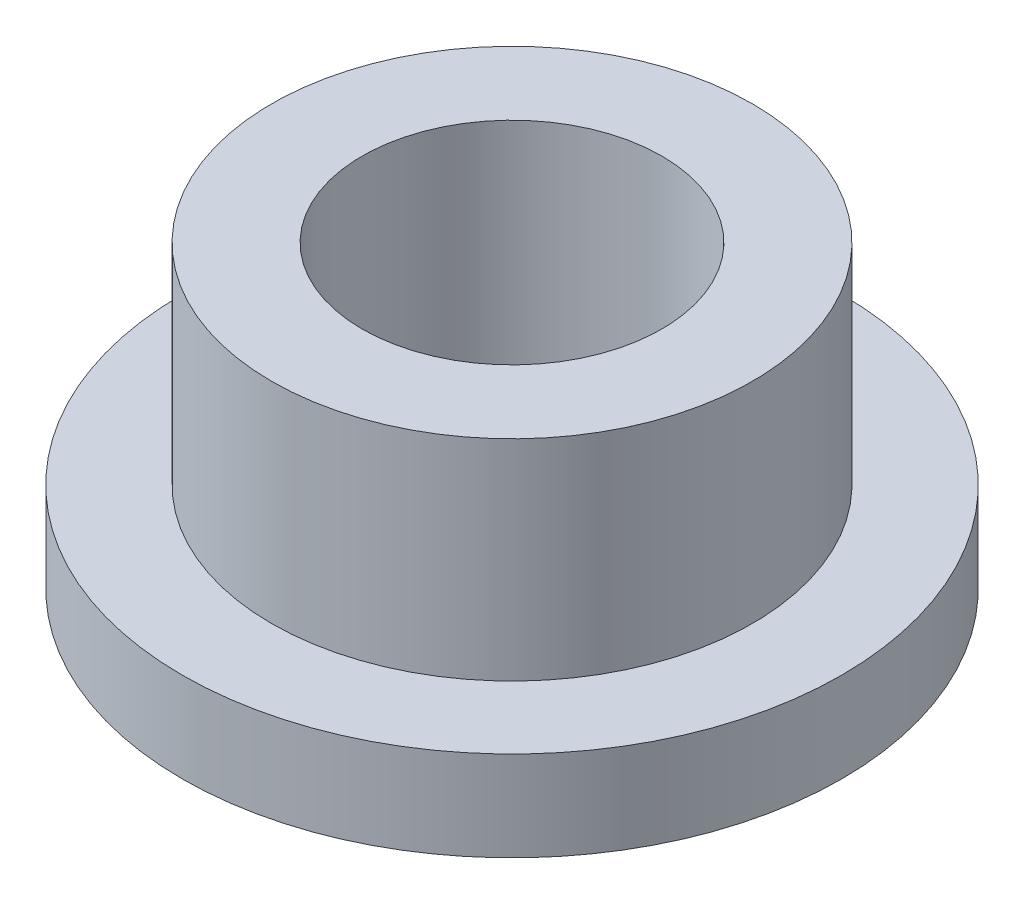
ISO-10303-21;
HEADER;
FILE_DESCRIPTION(('STEP AP214'),'2;1');
FILE_NAME('part.step','',(''),(''),'','','');
FILE_SCHEMA(('AUTOMOTIVE_DESIGN { 1 0 10303 214 1 1 1 1 }'));
ENDSEC;
DATA;
#1=APPLICATION_CONTEXT('core data for automotive mechanical design processes');
#2=APPLICATION_PROTOCOL_DEFINITION('international standard','automotive_design',2000,#1);
#3=PRODUCT_CONTEXT('',#1,'mechanical');
#4=PRODUCT('Part','Part','',(#3));
#5=PRODUCT_RELATED_PRODUCT_CATEGORY('part','',(#4));
#6=PRODUCT_DEFINITION_FORMATION('','',#4);
#7=PRODUCT_DEFINITION_CONTEXT('part definition',#1,'design');
#8=PRODUCT_DEFINITION('design','',#6,#7);
#9=PRODUCT_DEFINITION_SHAPE('','',#8);
#10=(LENGTH_UNIT() NAMED_UNIT(*) SI_UNIT(.MILLI.,.METRE.));
#11=(NAMED_UNIT(*) PLANE_ANGLE_UNIT() SI_UNIT($,.RADIAN.));
#12=(NAMED_UNIT(*) SI_UNIT($,.STERADIAN.) SOLID_ANGLE_UNIT());
#13=UNCERTAINTY_MEASURE_WITH_UNIT(LENGTH_MEASURE(1.E-05),#10,'distance_accuracy_value','');
#14=(GEOMETRIC_REPRESENTATION_CONTEXT(3) GLOBAL_UNCERTAINTY_ASSIGNED_CONTEXT((#13)) GLOBAL_UNIT_ASSIGNED_CONTEXT((#10,
#11,#12)) REPRESENTATION_CONTEXT('',''));
#15=CARTESIAN_POINT('',(0.,0.,0.));
#16=DIRECTION('',(0.,0.,1.));
#17=DIRECTION('',(1.,0.,0.));
#18=AXIS2_PLACEMENT_3D('',#15,#16,#17);
#19=CARTESIAN_POINT('',(0.,5.,0.));
#20=DIRECTION('',(0.,1.,0.));
#21=DIRECTION('',(0.,0.,1.));
#22=AXIS2_PLACEMENT_3D('',#19,#20,#21);
#23=PLANE('',#22);
#24=CARTESIAN_POINT('',(0.,5.,0.));
#25=DIRECTION('',(0.,1.,0.));
#26=DIRECTION('',(0.,0.,1.));
#27=AXIS2_PLACEMENT_3D('',#24,#25,#26);
#28=CIRCLE('',#27,4.01);
#29=CARTESIAN_POINT('',(0.,5.,4.01));
#30=VERTEX_POINT('',#29);
#31=EDGE_CURVE('E10',#30,#30,#28,.T.);
#32=ORIENTED_EDGE('',*,*,#31,.T.);
#33=EDGE_LOOP('',(#32));
#34=FACE_BOUND('',#33,.T.);
#35=CARTESIAN_POINT('',(0.,5.,0.));
#36=DIRECTION('',(0.,1.,0.));
#37=DIRECTION('',(0.,0.,1.));
#38=AXIS2_PLACEMENT_3D('',#35,#36,#37);
#39=CIRCLE('',#38,2.5);
#40=CARTESIAN_POINT('',(0.,5.,2.5));
#41=VERTEX_POINT('',#40);
#42=EDGE_CURVE('E37',#41,#41,#39,.T.);
#43=ORIENTED_EDGE('',*,*,#42,.F.);
#44=EDGE_LOOP('',(#43));
#45=FACE_BOUND('',#44,.T.);
#46=ADVANCED_FACE('F30',(#34,#45),#23,.T.);
#47=CARTESIAN_POINT('',(0.,0.,0.));
#48=DIRECTION('',(0.,1.,0.));
#49=DIRECTION('',(0.,0.,1.));
#50=AXIS2_PLACEMENT_3D('',#47,#48,#49);
#51=PLANE('',#50);
#52=CARTESIAN_POINT('',(0.,0.,0.));
#53=DIRECTION('',(0.,1.,0.));
#54=DIRECTION('',(0.,0.,1.));
#55=AXIS2_PLACEMENT_3D('',#52,#53,#54);
#56=CIRCLE('',#55,2.5);
#57=CARTESIAN_POINT('',(0.,0.,2.5));
#58=VERTEX_POINT('',#57);
#59=EDGE_CURVE('E41',#58,#58,#56,.T.);
#60=ORIENTED_EDGE('',*,*,#59,.T.);
#61=EDGE_LOOP('',(#60));
#62=FACE_BOUND('',#61,.T.);
#63=CARTESIAN_POINT('',(0.,0.,0.));
#64=DIRECTION('',(0.,1.,0.));
#65=DIRECTION('',(0.,0.,1.));
#66=AXIS2_PLACEMENT_3D('',#63,#64,#65);
#67=CIRCLE('',#66,5.5);
#68=CARTESIAN_POINT('',(0.,0.,5.5));
#69=VERTEX_POINT('',#68);
#70=EDGE_CURVE('E48',#69,#69,#67,.T.);
#71=ORIENTED_EDGE('',*,*,#70,.F.);
#72=EDGE_LOOP('',(#71));
#73=FACE_BOUND('',#72,.T.);
#74=ADVANCED_FACE('F73',(#62,#73),#51,.F.);
#75=CARTESIAN_POINT('',(0.,5.,0.));
#76=DIRECTION('',(0.,-1.,0.));
#77=DIRECTION('',(0.,0.,-1.));
#78=AXIS2_PLACEMENT_3D('',#75,#76,#77);
#79=CYLINDRICAL_SURFACE('',#78,4.01);
#80=CARTESIAN_POINT('',(0.,1.5,0.));
#81=DIRECTION('',(0.,1.,0.));
#82=DIRECTION('',(0.,0.,1.));
#83=AXIS2_PLACEMENT_3D('',#80,#81,#82);
#84=CIRCLE('',#83,4.01);
#85=CARTESIAN_POINT('',(0.,1.5,4.01));
#86=VERTEX_POINT('',#85);
#87=EDGE_CURVE('E51',#86,#86,#84,.T.);
#88=ORIENTED_EDGE('',*,*,#87,.T.);
#89=EDGE_LOOP('',(#88));
#90=FACE_BOUND('',#89,.T.);
#91=ORIENTED_EDGE('',*,*,#31,.F.);
#92=EDGE_LOOP('',(#91));
#93=FACE_BOUND('',#92,.T.);
#94=ADVANCED_FACE('F32',(#90,#93),#79,.T.);
#95=CARTESIAN_POINT('',(0.,5.,0.));
#96=DIRECTION('',(0.,-1.,0.));
#97=DIRECTION('',(0.,0.,-1.));
#98=AXIS2_PLACEMENT_3D('',#95,#96,#97);
#99=CYLINDRICAL_SURFACE('',#98,2.5);
#100=ORIENTED_EDGE('',*,*,#42,.T.);
#101=EDGE_LOOP('',(#100));
#102=FACE_BOUND('',#101,.T.);
#103=ORIENTED_EDGE('',*,*,#59,.F.);
#104=EDGE_LOOP('',(#103));
#105=FACE_BOUND('',#104,.T.);
#106=ADVANCED_FACE('F62',(#102,#105),#99,.F.);
#107=CARTESIAN_POINT('',(0.,1.5,0.));
#108=DIRECTION('',(0.,1.,0.));
#109=DIRECTION('',(0.,0.,1.));
#110=AXIS2_PLACEMENT_3D('',#107,#108,#109);
#111=PLANE('',#110);
#112=CARTESIAN_POINT('',(0.,1.5,0.));
#113=DIRECTION('',(0.,1.,0.));
#114=DIRECTION('',(0.,0.,1.));
#115=AXIS2_PLACEMENT_3D('',#112,#113,#114);
#116=CIRCLE('',#115,5.5);
#117=CARTESIAN_POINT('',(0.,1.5,5.5));
#118=VERTEX_POINT('',#117);
#119=EDGE_CURVE('E46',#118,#118,#116,.T.);
#120=ORIENTED_EDGE('',*,*,#119,.T.);
#121=EDGE_LOOP('',(#120));
#122=FACE_BOUND('',#121,.T.);
#123=ORIENTED_EDGE('',*,*,#87,.F.);
#124=EDGE_LOOP('',(#123));
#125=FACE_BOUND('',#124,.T.);
#126=ADVANCED_FACE('F59',(#122,#125),#111,.T.);
#127=CARTESIAN_POINT('',(0.,1.5,0.));
#128=DIRECTION('',(0.,-1.,0.));
#129=DIRECTION('',(0.,0.,-1.));
#130=AXIS2_PLACEMENT_3D('',#127,#128,#129);
#131=CYLINDRICAL_SURFACE('',#130,5.5);
#132=ORIENTED_EDGE('',*,*,#119,.F.);
#133=EDGE_LOOP('',(#132));
#134=FACE_BOUND('',#133,.T.);
#135=ORIENTED_EDGE('',*,*,#70,.T.);
#136=EDGE_LOOP('',(#135));
#137=FACE_BOUND('',#136,.T.);
#138=ADVANCED_FACE('F61',(#134,#137),#131,.T.);
#139=CLOSED_SHELL('',(#46,#74,#94,#106,#126,#138));
#140=MANIFOLD_SOLID_BREP('B2',#139);
#141=ADVANCED_BREP_SHAPE_REPRESENTATION('',(#18,#140),#14);
#142=SHAPE_DEFINITION_REPRESENTATION(#9,#141);
ENDSEC;
END-ISO-10303-21;
